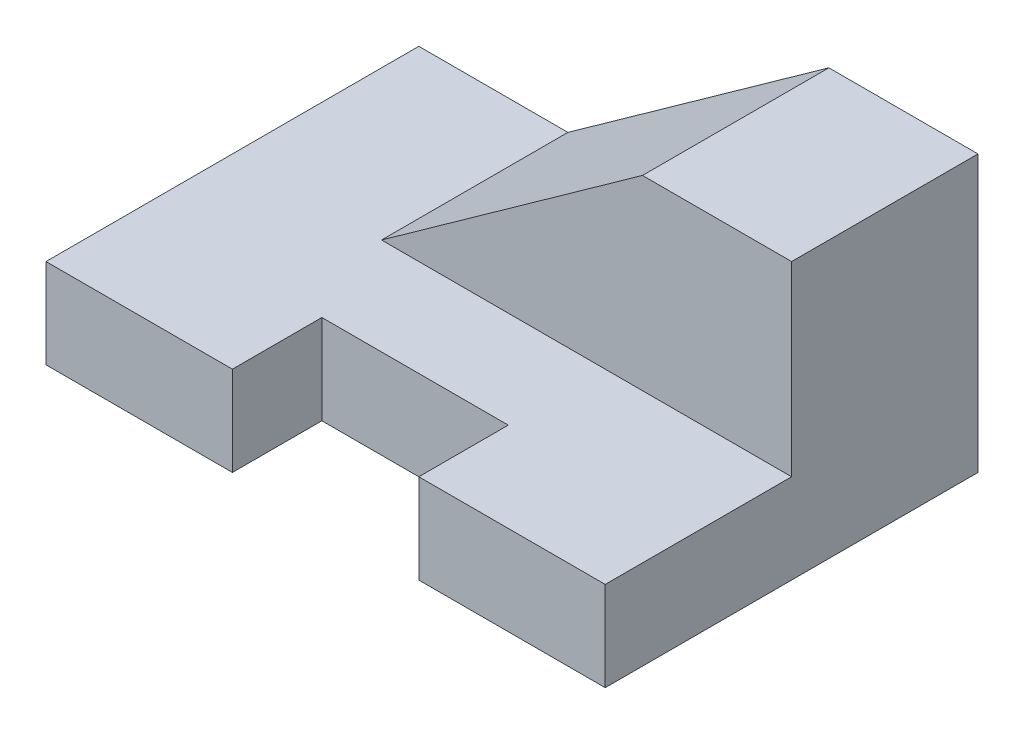
ISO-10303-21;
HEADER;
FILE_DESCRIPTION(('STEP AP214'),'2;1');
FILE_NAME('part.step','',(''),(''),'','','');
FILE_SCHEMA(('AUTOMOTIVE_DESIGN { 1 0 10303 214 1 1 1 1 }'));
ENDSEC;
DATA;
#1=APPLICATION_CONTEXT('core data for automotive mechanical design processes');
#2=APPLICATION_PROTOCOL_DEFINITION('international standard','automotive_design',2000,#1);
#3=PRODUCT_CONTEXT('',#1,'mechanical');
#4=PRODUCT('Part','Part','',(#3));
#5=PRODUCT_RELATED_PRODUCT_CATEGORY('part','',(#4));
#6=PRODUCT_DEFINITION_FORMATION('','',#4);
#7=PRODUCT_DEFINITION_CONTEXT('part definition',#1,'design');
#8=PRODUCT_DEFINITION('design','',#6,#7);
#9=PRODUCT_DEFINITION_SHAPE('','',#8);
#10=(LENGTH_UNIT() NAMED_UNIT(*) SI_UNIT(.MILLI.,.METRE.));
#11=(NAMED_UNIT(*) PLANE_ANGLE_UNIT() SI_UNIT($,.RADIAN.));
#12=(NAMED_UNIT(*) SI_UNIT($,.STERADIAN.) SOLID_ANGLE_UNIT());
#13=UNCERTAINTY_MEASURE_WITH_UNIT(LENGTH_MEASURE(1.E-05),#10,'distance_accuracy_value','');
#14=(GEOMETRIC_REPRESENTATION_CONTEXT(3) GLOBAL_UNCERTAINTY_ASSIGNED_CONTEXT((#13)) GLOBAL_UNIT_ASSIGNED_CONTEXT((#10,
#11,#12)) REPRESENTATION_CONTEXT('',''));
#15=CARTESIAN_POINT('',(0.,0.,0.));
#16=DIRECTION('',(0.,0.,1.));
#17=DIRECTION('',(1.,0.,0.));
#18=AXIS2_PLACEMENT_3D('',#15,#16,#17);
#19=CARTESIAN_POINT('',(0.,12.,0.));
#20=DIRECTION('',(0.,0.,-1.));
#21=DIRECTION('',(-1.,0.,0.));
#22=AXIS2_PLACEMENT_3D('',#19,#20,#21);
#23=PLANE('',#22);
#24=DIRECTION('',(1.,0.,0.));
#25=VECTOR('',#24,1.);
#26=CARTESIAN_POINT('',(0.,0.,0.));
#27=LINE('',#26,#25);
#28=CARTESIAN_POINT('',(0.,0.,0.));
#29=VERTEX_POINT('',#28);
#30=CARTESIAN_POINT('',(25.,0.,0.));
#31=VERTEX_POINT('',#30);
#32=EDGE_CURVE('E188',#29,#31,#27,.T.);
#33=ORIENTED_EDGE('',*,*,#32,.T.);
#34=DIRECTION('',(0.,-1.,0.));
#35=VECTOR('',#34,1.);
#36=CARTESIAN_POINT('',(25.,-0.000999999999999265,0.));
#37=LINE('',#36,#35);
#38=CARTESIAN_POINT('',(25.,12.,0.));
#39=VERTEX_POINT('',#38);
#40=EDGE_CURVE('E151',#39,#31,#37,.T.);
#41=ORIENTED_EDGE('',*,*,#40,.F.);
#42=DIRECTION('',(1.,0.,0.));
#43=VECTOR('',#42,1.);
#44=CARTESIAN_POINT('',(0.,12.,0.));
#45=LINE('',#44,#43);
#46=CARTESIAN_POINT('',(0.,12.,0.));
#47=VERTEX_POINT('',#46);
#48=EDGE_CURVE('E178',#47,#39,#45,.T.);
#49=ORIENTED_EDGE('',*,*,#48,.F.);
#50=DIRECTION('',(0.,-1.,0.));
#51=VECTOR('',#50,1.);
#52=CARTESIAN_POINT('',(0.,12.,0.));
#53=LINE('',#52,#51);
#54=EDGE_CURVE('E11',#47,#29,#53,.T.);
#55=ORIENTED_EDGE('',*,*,#54,.T.);
#56=EDGE_LOOP('',(#33,#41,#49,#55));
#57=FACE_BOUND('',#56,.T.);
#58=ADVANCED_FACE('F33',(#57),#23,.F.);
#59=CARTESIAN_POINT('',(0.,12.,0.));
#60=DIRECTION('',(1.,0.,0.));
#61=DIRECTION('',(0.,0.,-1.));
#62=AXIS2_PLACEMENT_3D('',#59,#60,#61);
#63=PLANE('',#62);
#64=DIRECTION('',(0.,0.,1.));
#65=VECTOR('',#64,1.);
#66=CARTESIAN_POINT('',(0.,0.,0.));
#67=LINE('',#66,#65);
#68=CARTESIAN_POINT('',(0.,0.,-50.));
#69=VERTEX_POINT('',#68);
#70=EDGE_CURVE('E172',#69,#29,#67,.T.);
#71=ORIENTED_EDGE('',*,*,#70,.T.);
#72=ORIENTED_EDGE('',*,*,#54,.F.);
#73=DIRECTION('',(0.,0.,1.));
#74=VECTOR('',#73,1.);
#75=CARTESIAN_POINT('',(0.,12.,0.));
#76=LINE('',#75,#74);
#77=CARTESIAN_POINT('',(0.,12.,-50.));
#78=VERTEX_POINT('',#77);
#79=EDGE_CURVE('E173',#78,#47,#76,.T.);
#80=ORIENTED_EDGE('',*,*,#79,.F.);
#81=DIRECTION('',(0.,-1.,0.));
#82=VECTOR('',#81,1.);
#83=CARTESIAN_POINT('',(0.,12.,-50.));
#84=LINE('',#83,#82);
#85=EDGE_CURVE('E184',#78,#69,#84,.T.);
#86=ORIENTED_EDGE('',*,*,#85,.T.);
#87=EDGE_LOOP('',(#71,#72,#80,#86));
#88=FACE_BOUND('',#87,.T.);
#89=ADVANCED_FACE('F35',(#88),#63,.F.);
#90=CARTESIAN_POINT('',(50.,12.,0.));
#91=VERTEX_POINT('',#90);
#92=CARTESIAN_POINT('',(75.,12.,0.));
#93=VERTEX_POINT('',#92);
#94=EDGE_CURVE('E176',#91,#93,#45,.T.);
#95=ORIENTED_EDGE('',*,*,#94,.F.);
#96=DIRECTION('',(0.,1.,0.));
#97=VECTOR('',#96,1.);
#98=CARTESIAN_POINT('',(50.,-0.000999999999999265,0.));
#99=LINE('',#98,#97);
#100=CARTESIAN_POINT('',(50.,0.,0.));
#101=VERTEX_POINT('',#100);
#102=EDGE_CURVE('E148',#101,#91,#99,.T.);
#103=ORIENTED_EDGE('',*,*,#102,.F.);
#104=CARTESIAN_POINT('',(75.,0.,0.));
#105=VERTEX_POINT('',#104);
#106=EDGE_CURVE('E187',#101,#105,#27,.T.);
#107=ORIENTED_EDGE('',*,*,#106,.T.);
#108=DIRECTION('',(0.,-1.,0.));
#109=VECTOR('',#108,1.);
#110=CARTESIAN_POINT('',(75.,12.,0.));
#111=LINE('',#110,#109);
#112=EDGE_CURVE('E41',#93,#105,#111,.T.);
#113=ORIENTED_EDGE('',*,*,#112,.F.);
#114=EDGE_LOOP('',(#95,#103,#107,#113));
#115=FACE_BOUND('',#114,.T.);
#116=ADVANCED_FACE('F234',(#115),#23,.F.);
#117=CARTESIAN_POINT('',(75.,12.,0.));
#118=DIRECTION('',(-1.,0.,0.));
#119=DIRECTION('',(0.,0.,1.));
#120=AXIS2_PLACEMENT_3D('',#117,#118,#119);
#121=PLANE('',#120);
#122=DIRECTION('',(0.,0.,-1.));
#123=VECTOR('',#122,1.);
#124=CARTESIAN_POINT('',(75.,0.,0.));
#125=LINE('',#124,#123);
#126=CARTESIAN_POINT('',(75.,0.,-50.));
#127=VERTEX_POINT('',#126);
#128=EDGE_CURVE('E191',#105,#127,#125,.T.);
#129=ORIENTED_EDGE('',*,*,#128,.T.);
#130=DIRECTION('',(0.,-1.,0.));
#131=VECTOR('',#130,1.);
#132=CARTESIAN_POINT('',(75.,12.,-50.));
#133=LINE('',#132,#131);
#134=CARTESIAN_POINT('',(75.,37.,-50.));
#135=VERTEX_POINT('',#134);
#136=EDGE_CURVE('E196',#135,#127,#133,.T.);
#137=ORIENTED_EDGE('',*,*,#136,.F.);
#138=DIRECTION('',(0.,0.,-1.));
#139=VECTOR('',#138,1.);
#140=CARTESIAN_POINT('',(75.,37.,-25.));
#141=LINE('',#140,#139);
#142=CARTESIAN_POINT('',(75.,37.,-25.));
#143=VERTEX_POINT('',#142);
#144=EDGE_CURVE('E145',#143,#135,#141,.T.);
#145=ORIENTED_EDGE('',*,*,#144,.F.);
#146=DIRECTION('',(0.,-1.,0.));
#147=VECTOR('',#146,1.);
#148=CARTESIAN_POINT('',(75.,12.,-25.));
#149=LINE('',#148,#147);
#150=CARTESIAN_POINT('',(75.,12.,-25.));
#151=VERTEX_POINT('',#150);
#152=EDGE_CURVE('E122',#143,#151,#149,.T.);
#153=ORIENTED_EDGE('',*,*,#152,.T.);
#154=DIRECTION('',(0.,0.,-1.));
#155=VECTOR('',#154,1.);
#156=CARTESIAN_POINT('',(75.,12.,0.));
#157=LINE('',#156,#155);
#158=EDGE_CURVE('E136',#93,#151,#157,.T.);
#159=ORIENTED_EDGE('',*,*,#158,.F.);
#160=ORIENTED_EDGE('',*,*,#112,.T.);
#161=EDGE_LOOP('',(#129,#137,#145,#153,#159,#160));
#162=FACE_BOUND('',#161,.T.);
#163=ADVANCED_FACE('F202',(#162),#121,.F.);
#164=CARTESIAN_POINT('',(0.,12.,-50.));
#165=DIRECTION('',(0.,0.,1.));
#166=DIRECTION('',(1.,0.,0.));
#167=AXIS2_PLACEMENT_3D('',#164,#165,#166);
#168=PLANE('',#167);
#169=DIRECTION('',(-1.,0.,0.));
#170=VECTOR('',#169,1.);
#171=CARTESIAN_POINT('',(0.,0.,-50.));
#172=LINE('',#171,#170);
#173=EDGE_CURVE('E177',#127,#69,#172,.T.);
#174=ORIENTED_EDGE('',*,*,#173,.T.);
#175=ORIENTED_EDGE('',*,*,#85,.F.);
#176=DIRECTION('',(-1.,0.,0.));
#177=VECTOR('',#176,1.);
#178=CARTESIAN_POINT('',(0.,12.,-50.));
#179=LINE('',#178,#177);
#180=CARTESIAN_POINT('',(20.,12.,-50.));
#181=VERTEX_POINT('',#180);
#182=EDGE_CURVE('E182',#181,#78,#179,.T.);
#183=ORIENTED_EDGE('',*,*,#182,.F.);
#184=DIRECTION('',(0.813733471206735,0.581238193719097,0.));
#185=VECTOR('',#184,1.);
#186=CARTESIAN_POINT('',(55.,37.,-50.));
#187=LINE('',#186,#185);
#188=CARTESIAN_POINT('',(55.,37.,-50.));
#189=VERTEX_POINT('',#188);
#190=EDGE_CURVE('E48',#181,#189,#187,.T.);
#191=ORIENTED_EDGE('',*,*,#190,.T.);
#192=DIRECTION('',(1.,0.,0.));
#193=VECTOR('',#192,1.);
#194=CARTESIAN_POINT('',(75.,37.,-50.));
#195=LINE('',#194,#193);
#196=EDGE_CURVE('E137',#189,#135,#195,.T.);
#197=ORIENTED_EDGE('',*,*,#196,.T.);
#198=ORIENTED_EDGE('',*,*,#136,.T.);
#199=EDGE_LOOP('',(#174,#175,#183,#191,#197,#198));
#200=FACE_BOUND('',#199,.T.);
#201=ADVANCED_FACE('F212',(#200),#168,.F.);
#202=CARTESIAN_POINT('',(0.,12.,0.));
#203=DIRECTION('',(0.,-1.,0.));
#204=DIRECTION('',(0.,0.,-1.));
#205=AXIS2_PLACEMENT_3D('',#202,#203,#204);
#206=PLANE('',#205);
#207=ORIENTED_EDGE('',*,*,#158,.T.);
#208=DIRECTION('',(-1.,0.,0.));
#209=VECTOR('',#208,1.);
#210=CARTESIAN_POINT('',(20.,12.,-25.));
#211=LINE('',#210,#209);
#212=CARTESIAN_POINT('',(20.,12.,-25.));
#213=VERTEX_POINT('',#212);
#214=EDGE_CURVE('E128',#151,#213,#211,.T.);
#215=ORIENTED_EDGE('',*,*,#214,.T.);
#216=DIRECTION('',(0.,0.,-1.));
#217=VECTOR('',#216,1.);
#218=CARTESIAN_POINT('',(20.,12.,-25.));
#219=LINE('',#218,#217);
#220=EDGE_CURVE('E114',#213,#181,#219,.T.);
#221=ORIENTED_EDGE('',*,*,#220,.T.);
#222=ORIENTED_EDGE('',*,*,#182,.T.);
#223=ORIENTED_EDGE('',*,*,#79,.T.);
#224=ORIENTED_EDGE('',*,*,#48,.T.);
#225=DIRECTION('',(0.,0.,1.));
#226=VECTOR('',#225,1.);
#227=CARTESIAN_POINT('',(25.,12.,12.));
#228=LINE('',#227,#226);
#229=CARTESIAN_POINT('',(25.,12.,-12.));
#230=VERTEX_POINT('',#229);
#231=EDGE_CURVE('E157',#230,#39,#228,.T.);
#232=ORIENTED_EDGE('',*,*,#231,.F.);
#233=DIRECTION('',(-1.,0.,0.));
#234=VECTOR('',#233,1.);
#235=CARTESIAN_POINT('',(50.,12.,-12.));
#236=LINE('',#235,#234);
#237=CARTESIAN_POINT('',(50.,12.,-12.));
#238=VERTEX_POINT('',#237);
#239=EDGE_CURVE('E162',#238,#230,#236,.T.);
#240=ORIENTED_EDGE('',*,*,#239,.F.);
#241=DIRECTION('',(0.,0.,-1.));
#242=VECTOR('',#241,1.);
#243=CARTESIAN_POINT('',(50.,12.,12.));
#244=LINE('',#243,#242);
#245=EDGE_CURVE('E159',#91,#238,#244,.T.);
#246=ORIENTED_EDGE('',*,*,#245,.F.);
#247=ORIENTED_EDGE('',*,*,#94,.T.);
#248=EDGE_LOOP('',(#207,#215,#221,#222,#223,#224,#232,#240,#246,#247));
#249=FACE_BOUND('',#248,.T.);
#250=ADVANCED_FACE('F134',(#249),#206,.F.);
#251=CARTESIAN_POINT('',(0.,0.,0.));
#252=DIRECTION('',(0.,-1.,0.));
#253=DIRECTION('',(0.,0.,-1.));
#254=AXIS2_PLACEMENT_3D('',#251,#252,#253);
#255=PLANE('',#254);
#256=DIRECTION('',(0.,0.,1.));
#257=VECTOR('',#256,1.);
#258=CARTESIAN_POINT('',(25.,0.,12.));
#259=LINE('',#258,#257);
#260=CARTESIAN_POINT('',(25.,0.,-12.));
#261=VERTEX_POINT('',#260);
#262=EDGE_CURVE('E56',#261,#31,#259,.T.);
#263=ORIENTED_EDGE('',*,*,#262,.T.);
#264=ORIENTED_EDGE('',*,*,#32,.F.);
#265=ORIENTED_EDGE('',*,*,#70,.F.);
#266=ORIENTED_EDGE('',*,*,#173,.F.);
#267=ORIENTED_EDGE('',*,*,#128,.F.);
#268=ORIENTED_EDGE('',*,*,#106,.F.);
#269=DIRECTION('',(0.,0.,-1.));
#270=VECTOR('',#269,1.);
#271=CARTESIAN_POINT('',(50.,0.,12.));
#272=LINE('',#271,#270);
#273=CARTESIAN_POINT('',(50.,0.,-12.));
#274=VERTEX_POINT('',#273);
#275=EDGE_CURVE('E168',#101,#274,#272,.T.);
#276=ORIENTED_EDGE('',*,*,#275,.T.);
#277=DIRECTION('',(-1.,0.,0.));
#278=VECTOR('',#277,1.);
#279=CARTESIAN_POINT('',(50.,0.,-12.));
#280=LINE('',#279,#278);
#281=EDGE_CURVE('E153',#274,#261,#280,.T.);
#282=ORIENTED_EDGE('',*,*,#281,.T.);
#283=EDGE_LOOP('',(#263,#264,#265,#266,#267,#268,#276,#282));
#284=FACE_BOUND('',#283,.T.);
#285=ADVANCED_FACE('F208',(#284),#255,.T.);
#286=CARTESIAN_POINT('',(25.,-0.000999999999999265,12.));
#287=DIRECTION('',(-1.,0.,0.));
#288=DIRECTION('',(0.,0.,1.));
#289=AXIS2_PLACEMENT_3D('',#286,#287,#288);
#290=PLANE('',#289);
#291=ORIENTED_EDGE('',*,*,#40,.T.);
#292=ORIENTED_EDGE('',*,*,#262,.F.);
#293=DIRECTION('',(0.,1.,0.));
#294=VECTOR('',#293,1.);
#295=CARTESIAN_POINT('',(25.,-0.000999999999999265,-12.));
#296=LINE('',#295,#294);
#297=EDGE_CURVE('E166',#261,#230,#296,.T.);
#298=ORIENTED_EDGE('',*,*,#297,.T.);
#299=ORIENTED_EDGE('',*,*,#231,.T.);
#300=EDGE_LOOP('',(#291,#292,#298,#299));
#301=FACE_BOUND('',#300,.T.);
#302=ADVANCED_FACE('F248',(#301),#290,.F.);
#303=CARTESIAN_POINT('',(50.,-0.000999999999999265,12.));
#304=DIRECTION('',(1.,0.,0.));
#305=DIRECTION('',(0.,0.,-1.));
#306=AXIS2_PLACEMENT_3D('',#303,#304,#305);
#307=PLANE('',#306);
#308=ORIENTED_EDGE('',*,*,#102,.T.);
#309=ORIENTED_EDGE('',*,*,#245,.T.);
#310=DIRECTION('',(0.,1.,0.));
#311=VECTOR('',#310,1.);
#312=CARTESIAN_POINT('',(50.,-0.000999999999999265,-12.));
#313=LINE('',#312,#311);
#314=EDGE_CURVE('E165',#274,#238,#313,.T.);
#315=ORIENTED_EDGE('',*,*,#314,.F.);
#316=ORIENTED_EDGE('',*,*,#275,.F.);
#317=EDGE_LOOP('',(#308,#309,#315,#316));
#318=FACE_BOUND('',#317,.T.);
#319=ADVANCED_FACE('F228',(#318),#307,.F.);
#320=CARTESIAN_POINT('',(50.,-0.000999999999999265,-12.));
#321=DIRECTION('',(0.,0.,-1.));
#322=DIRECTION('',(-1.,0.,0.));
#323=AXIS2_PLACEMENT_3D('',#320,#321,#322);
#324=PLANE('',#323);
#325=ORIENTED_EDGE('',*,*,#314,.T.);
#326=ORIENTED_EDGE('',*,*,#239,.T.);
#327=ORIENTED_EDGE('',*,*,#297,.F.);
#328=ORIENTED_EDGE('',*,*,#281,.F.);
#329=EDGE_LOOP('',(#325,#326,#327,#328));
#330=FACE_BOUND('',#329,.T.);
#331=ADVANCED_FACE('F221',(#330),#324,.F.);
#332=CARTESIAN_POINT('',(75.,37.,-25.));
#333=DIRECTION('',(0.,1.,0.));
#334=DIRECTION('',(0.,0.,1.));
#335=AXIS2_PLACEMENT_3D('',#332,#333,#334);
#336=PLANE('',#335);
#337=ORIENTED_EDGE('',*,*,#196,.F.);
#338=DIRECTION('',(0.,0.,-1.));
#339=VECTOR('',#338,1.);
#340=CARTESIAN_POINT('',(55.,37.,-25.));
#341=LINE('',#340,#339);
#342=CARTESIAN_POINT('',(55.,37.,-25.));
#343=VERTEX_POINT('',#342);
#344=EDGE_CURVE('E121',#343,#189,#341,.T.);
#345=ORIENTED_EDGE('',*,*,#344,.F.);
#346=DIRECTION('',(1.,0.,0.));
#347=VECTOR('',#346,1.);
#348=CARTESIAN_POINT('',(75.,37.,-25.));
#349=LINE('',#348,#347);
#350=EDGE_CURVE('E131',#343,#143,#349,.T.);
#351=ORIENTED_EDGE('',*,*,#350,.T.);
#352=ORIENTED_EDGE('',*,*,#144,.T.);
#353=EDGE_LOOP('',(#337,#345,#351,#352));
#354=FACE_BOUND('',#353,.T.);
#355=ADVANCED_FACE('F219',(#354),#336,.T.);
#356=CARTESIAN_POINT('',(55.,37.,-25.));
#357=DIRECTION('',(-0.581238193719097,0.813733471206735,0.));
#358=DIRECTION('',(-0.813733471206735,-0.581238193719097,0.));
#359=AXIS2_PLACEMENT_3D('',#356,#357,#358);
#360=PLANE('',#359);
#361=ORIENTED_EDGE('',*,*,#190,.F.);
#362=ORIENTED_EDGE('',*,*,#220,.F.);
#363=DIRECTION('',(0.813733471206735,0.581238193719097,0.));
#364=VECTOR('',#363,1.);
#365=CARTESIAN_POINT('',(55.,37.,-25.));
#366=LINE('',#365,#364);
#367=EDGE_CURVE('E117',#213,#343,#366,.T.);
#368=ORIENTED_EDGE('',*,*,#367,.T.);
#369=ORIENTED_EDGE('',*,*,#344,.T.);
#370=EDGE_LOOP('',(#361,#362,#368,#369));
#371=FACE_BOUND('',#370,.T.);
#372=ADVANCED_FACE('F116',(#371),#360,.T.);
#373=CARTESIAN_POINT('',(0.,0.,-25.));
#374=DIRECTION('',(0.,0.,1.));
#375=DIRECTION('',(1.,0.,0.));
#376=AXIS2_PLACEMENT_3D('',#373,#374,#375);
#377=PLANE('',#376);
#378=ORIENTED_EDGE('',*,*,#214,.F.);
#379=ORIENTED_EDGE('',*,*,#152,.F.);
#380=ORIENTED_EDGE('',*,*,#350,.F.);
#381=ORIENTED_EDGE('',*,*,#367,.F.);
#382=EDGE_LOOP('',(#378,#379,#380,#381));
#383=FACE_BOUND('',#382,.T.);
#384=ADVANCED_FACE('F126',(#383),#377,.T.);
#385=CLOSED_SHELL('',(#58,#89,#116,#163,#201,#250,#285,#302,#319,#331,#355,#372,#384));
#386=MANIFOLD_SOLID_BREP('B2',#385);
#387=ADVANCED_BREP_SHAPE_REPRESENTATION('',(#18,#386),#14);
#388=SHAPE_DEFINITION_REPRESENTATION(#9,#387);
ENDSEC;
END-ISO-10303-21;
